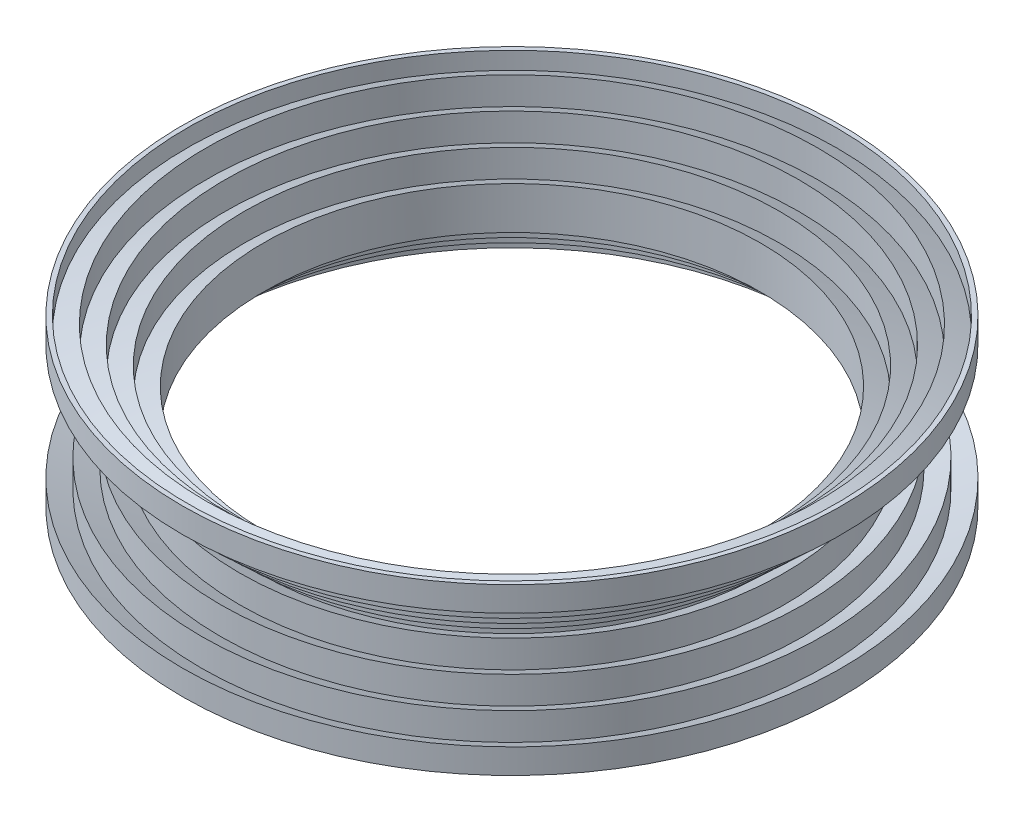
ISO-10303-21;
HEADER;
FILE_DESCRIPTION(('STEP AP214'),'2;1');
FILE_NAME('part.step','',(''),(''),'','','');
FILE_SCHEMA(('AUTOMOTIVE_DESIGN { 1 0 10303 214 1 1 1 1 }'));
ENDSEC;
DATA;
#1=APPLICATION_CONTEXT('core data for automotive mechanical design processes');
#2=APPLICATION_PROTOCOL_DEFINITION('international standard','automotive_design',2000,#1);
#3=PRODUCT_CONTEXT('',#1,'mechanical');
#4=PRODUCT('Part','Part','',(#3));
#5=PRODUCT_RELATED_PRODUCT_CATEGORY('part','',(#4));
#6=PRODUCT_DEFINITION_FORMATION('','',#4);
#7=PRODUCT_DEFINITION_CONTEXT('part definition',#1,'design');
#8=PRODUCT_DEFINITION('design','',#6,#7);
#9=PRODUCT_DEFINITION_SHAPE('','',#8);
#10=(LENGTH_UNIT() NAMED_UNIT(*) SI_UNIT(.MILLI.,.METRE.));
#11=(NAMED_UNIT(*) PLANE_ANGLE_UNIT() SI_UNIT($,.RADIAN.));
#12=(NAMED_UNIT(*) SI_UNIT($,.STERADIAN.) SOLID_ANGLE_UNIT());
#13=UNCERTAINTY_MEASURE_WITH_UNIT(LENGTH_MEASURE(1.E-05),#10,'distance_accuracy_value','');
#14=(GEOMETRIC_REPRESENTATION_CONTEXT(3) GLOBAL_UNCERTAINTY_ASSIGNED_CONTEXT((#13)) GLOBAL_UNIT_ASSIGNED_CONTEXT((#10,
#11,#12)) REPRESENTATION_CONTEXT('',''));
#15=CARTESIAN_POINT('',(0.,0.,0.));
#16=DIRECTION('',(0.,0.,1.));
#17=DIRECTION('',(1.,0.,0.));
#18=AXIS2_PLACEMENT_3D('',#15,#16,#17);
#19=CARTESIAN_POINT('',(0.,1.2,0.));
#20=DIRECTION('',(0.,-1.,0.));
#21=DIRECTION('',(0.,0.,-1.));
#22=AXIS2_PLACEMENT_3D('',#19,#20,#21);
#23=CYLINDRICAL_SURFACE('',#22,35.8938037049019);
#24=CARTESIAN_POINT('',(0.,0.,0.));
#25=DIRECTION('',(0.,1.,0.));
#26=DIRECTION('',(0.,0.,1.));
#27=AXIS2_PLACEMENT_3D('',#24,#25,#26);
#28=CIRCLE('',#27,35.8938037049019);
#29=CARTESIAN_POINT('',(0.,0.,35.8938037049019));
#30=VERTEX_POINT('',#29);
#31=EDGE_CURVE('E10',#30,#30,#28,.T.);
#32=ORIENTED_EDGE('',*,*,#31,.T.);
#33=EDGE_LOOP('',(#32));
#34=FACE_BOUND('',#33,.T.);
#35=CARTESIAN_POINT('',(0.,2.7,0.));
#36=DIRECTION('',(0.,1.,0.));
#37=DIRECTION('',(0.,0.,1.));
#38=AXIS2_PLACEMENT_3D('',#35,#36,#37);
#39=CIRCLE('',#38,35.8938037049019);
#40=CARTESIAN_POINT('',(0.,2.7,35.8938037049019));
#41=VERTEX_POINT('',#40);
#42=EDGE_CURVE('E77',#41,#41,#39,.T.);
#43=ORIENTED_EDGE('',*,*,#42,.F.);
#44=EDGE_LOOP('',(#43));
#45=FACE_BOUND('',#44,.T.);
#46=ADVANCED_FACE('F38',(#34,#45),#23,.T.);
#47=CARTESIAN_POINT('',(0.,0.,0.));
#48=DIRECTION('',(0.,1.,0.));
#49=DIRECTION('',(0.,0.,1.));
#50=AXIS2_PLACEMENT_3D('',#47,#48,#49);
#51=PLANE('',#50);
#52=CARTESIAN_POINT('',(0.,0.,0.));
#53=DIRECTION('',(0.,1.,0.));
#54=DIRECTION('',(0.,0.,1.));
#55=AXIS2_PLACEMENT_3D('',#52,#53,#54);
#56=CIRCLE('',#55,35.3938037049019);
#57=CARTESIAN_POINT('',(0.,0.,35.3938037049019));
#58=VERTEX_POINT('',#57);
#59=EDGE_CURVE('E120',#58,#58,#56,.T.);
#60=ORIENTED_EDGE('',*,*,#59,.T.);
#61=EDGE_LOOP('',(#60));
#62=FACE_BOUND('',#61,.T.);
#63=ORIENTED_EDGE('',*,*,#31,.F.);
#64=EDGE_LOOP('',(#63));
#65=FACE_BOUND('',#64,.T.);
#66=ADVANCED_FACE('F208',(#62,#65),#51,.F.);
#67=CARTESIAN_POINT('',(0.,8.55328911237355,0.));
#68=DIRECTION('',(0.,1.,0.));
#69=DIRECTION('',(0.,0.,1.));
#70=AXIS2_PLACEMENT_3D('',#67,#68,#69);
#71=CONICAL_SURFACE('',#70,29.6615082556337,1.10323322026267);
#72=CARTESIAN_POINT('',(0.,7.50438548316474,0.));
#73=DIRECTION('',(0.,1.,0.));
#74=DIRECTION('',(0.,0.,1.));
#75=AXIS2_PLACEMENT_3D('',#72,#73,#74);
#76=CIRCLE('',#75,27.584076439211);
#77=CARTESIAN_POINT('',(0.,7.50438548316474,27.584076439211));
#78=VERTEX_POINT('',#77);
#79=EDGE_CURVE('E81',#78,#78,#76,.T.);
#80=ORIENTED_EDGE('',*,*,#79,.F.);
#81=EDGE_LOOP('',(#80));
#82=FACE_BOUND('',#81,.T.);
#83=CARTESIAN_POINT('',(0.,8.55328911237355,0.));
#84=DIRECTION('',(0.,1.,0.));
#85=DIRECTION('',(0.,0.,1.));
#86=AXIS2_PLACEMENT_3D('',#83,#84,#85);
#87=CIRCLE('',#86,29.6615082556337);
#88=CARTESIAN_POINT('',(0.,8.55328911237355,29.6615082556337));
#89=VERTEX_POINT('',#88);
#90=EDGE_CURVE('E45',#89,#89,#87,.T.);
#91=ORIENTED_EDGE('',*,*,#90,.T.);
#92=EDGE_LOOP('',(#91));
#93=FACE_BOUND('',#92,.T.);
#94=ADVANCED_FACE('F211',(#82,#93),#71,.F.);
#95=CARTESIAN_POINT('',(0.,9.,0.));
#96=DIRECTION('',(0.,1.,0.));
#97=DIRECTION('',(0.,0.,1.));
#98=AXIS2_PLACEMENT_3D('',#95,#96,#97);
#99=CYLINDRICAL_SURFACE('',#98,29.6615082556337);
#100=ORIENTED_EDGE('',*,*,#90,.F.);
#101=EDGE_LOOP('',(#100));
#102=FACE_BOUND('',#101,.T.);
#103=CARTESIAN_POINT('',(0.,5.55328911237355,0.));
#104=DIRECTION('',(0.,1.,0.));
#105=DIRECTION('',(0.,0.,1.));
#106=AXIS2_PLACEMENT_3D('',#103,#104,#105);
#107=CIRCLE('',#106,29.6615082556337);
#108=CARTESIAN_POINT('',(0.,5.55328911237355,29.6615082556337));
#109=VERTEX_POINT('',#108);
#110=EDGE_CURVE('E52',#109,#109,#107,.T.);
#111=ORIENTED_EDGE('',*,*,#110,.T.);
#112=EDGE_LOOP('',(#111));
#113=FACE_BOUND('',#112,.T.);
#114=ADVANCED_FACE('F244',(#102,#113),#99,.T.);
#115=CARTESIAN_POINT('',(0.,6.60219274158237,0.));
#116=DIRECTION('',(0.,1.,0.));
#117=DIRECTION('',(0.,0.,1.));
#118=AXIS2_PLACEMENT_3D('',#115,#116,#117);
#119=CONICAL_SURFACE('',#118,31.7389400720564,1.10323322026267);
#120=ORIENTED_EDGE('',*,*,#110,.F.);
#121=EDGE_LOOP('',(#120));
#122=FACE_BOUND('',#121,.T.);
#123=CARTESIAN_POINT('',(0.,6.60219274158237,0.));
#124=DIRECTION('',(0.,1.,0.));
#125=DIRECTION('',(0.,0.,1.));
#126=AXIS2_PLACEMENT_3D('',#123,#124,#125);
#127=CIRCLE('',#126,31.7389400720564);
#128=CARTESIAN_POINT('',(0.,6.60219274158237,31.7389400720564));
#129=VERTEX_POINT('',#128);
#130=EDGE_CURVE('E59',#129,#129,#127,.T.);
#131=ORIENTED_EDGE('',*,*,#130,.T.);
#132=EDGE_LOOP('',(#131));
#133=FACE_BOUND('',#132,.T.);
#134=ADVANCED_FACE('F240',(#122,#133),#119,.F.);
#135=CARTESIAN_POINT('',(0.,9.,0.));
#136=DIRECTION('',(0.,1.,0.));
#137=DIRECTION('',(0.,0.,1.));
#138=AXIS2_PLACEMENT_3D('',#135,#136,#137);
#139=CYLINDRICAL_SURFACE('',#138,31.7389400720564);
#140=ORIENTED_EDGE('',*,*,#130,.F.);
#141=EDGE_LOOP('',(#140));
#142=FACE_BOUND('',#141,.T.);
#143=CARTESIAN_POINT('',(0.,3.60219274158237,0.));
#144=DIRECTION('',(0.,1.,0.));
#145=DIRECTION('',(0.,0.,1.));
#146=AXIS2_PLACEMENT_3D('',#143,#144,#145);
#147=CIRCLE('',#146,31.7389400720564);
#148=CARTESIAN_POINT('',(0.,3.60219274158237,31.7389400720564));
#149=VERTEX_POINT('',#148);
#150=EDGE_CURVE('E65',#149,#149,#147,.T.);
#151=ORIENTED_EDGE('',*,*,#150,.T.);
#152=EDGE_LOOP('',(#151));
#153=FACE_BOUND('',#152,.T.);
#154=ADVANCED_FACE('F236',(#142,#153),#139,.T.);
#155=CARTESIAN_POINT('',(0.,4.65109637079118,0.));
#156=DIRECTION('',(0.,1.,0.));
#157=DIRECTION('',(0.,0.,1.));
#158=AXIS2_PLACEMENT_3D('',#155,#156,#157);
#159=CONICAL_SURFACE('',#158,33.8163718884792,1.10323322026267);
#160=ORIENTED_EDGE('',*,*,#150,.F.);
#161=EDGE_LOOP('',(#160));
#162=FACE_BOUND('',#161,.T.);
#163=CARTESIAN_POINT('',(0.,4.65109637079118,0.));
#164=DIRECTION('',(0.,1.,0.));
#165=DIRECTION('',(0.,0.,1.));
#166=AXIS2_PLACEMENT_3D('',#163,#164,#165);
#167=CIRCLE('',#166,33.8163718884792);
#168=CARTESIAN_POINT('',(0.,4.65109637079118,33.8163718884792));
#169=VERTEX_POINT('',#168);
#170=EDGE_CURVE('E69',#169,#169,#167,.T.);
#171=ORIENTED_EDGE('',*,*,#170,.T.);
#172=EDGE_LOOP('',(#171));
#173=FACE_BOUND('',#172,.T.);
#174=ADVANCED_FACE('F228',(#162,#173),#159,.F.);
#175=CARTESIAN_POINT('',(0.,9.,0.));
#176=DIRECTION('',(0.,1.,0.));
#177=DIRECTION('',(0.,0.,1.));
#178=AXIS2_PLACEMENT_3D('',#175,#176,#177);
#179=CYLINDRICAL_SURFACE('',#178,33.8163718884792);
#180=ORIENTED_EDGE('',*,*,#170,.F.);
#181=EDGE_LOOP('',(#180));
#182=FACE_BOUND('',#181,.T.);
#183=CARTESIAN_POINT('',(0.,1.65109637079118,0.));
#184=DIRECTION('',(0.,1.,0.));
#185=DIRECTION('',(0.,0.,1.));
#186=AXIS2_PLACEMENT_3D('',#183,#184,#185);
#187=CIRCLE('',#186,33.8163718884792);
#188=CARTESIAN_POINT('',(0.,1.65109637079118,33.8163718884792));
#189=VERTEX_POINT('',#188);
#190=EDGE_CURVE('E73',#189,#189,#187,.T.);
#191=ORIENTED_EDGE('',*,*,#190,.T.);
#192=EDGE_LOOP('',(#191));
#193=FACE_BOUND('',#192,.T.);
#194=ADVANCED_FACE('F219',(#182,#193),#179,.T.);
#195=CARTESIAN_POINT('',(0.,2.7,0.));
#196=DIRECTION('',(0.,1.,0.));
#197=DIRECTION('',(0.,0.,1.));
#198=AXIS2_PLACEMENT_3D('',#195,#196,#197);
#199=CONICAL_SURFACE('',#198,35.8938037049019,1.10323322026267);
#200=ORIENTED_EDGE('',*,*,#190,.F.);
#201=EDGE_LOOP('',(#200));
#202=FACE_BOUND('',#201,.T.);
#203=ORIENTED_EDGE('',*,*,#42,.T.);
#204=EDGE_LOOP('',(#203));
#205=FACE_BOUND('',#204,.T.);
#206=ADVANCED_FACE('F216',(#202,#205),#199,.F.);
#207=CARTESIAN_POINT('',(0.,9.,0.));
#208=DIRECTION('',(0.,1.,0.));
#209=DIRECTION('',(0.,0.,1.));
#210=AXIS2_PLACEMENT_3D('',#207,#208,#209);
#211=CYLINDRICAL_SURFACE('',#210,27.584076439211);
#212=ORIENTED_EDGE('',*,*,#79,.T.);
#213=EDGE_LOOP('',(#212));
#214=FACE_BOUND('',#213,.T.);
#215=CARTESIAN_POINT('',(0.,10.4956145168353,0.));
#216=DIRECTION('',(0.,1.,0.));
#217=DIRECTION('',(0.,0.,1.));
#218=AXIS2_PLACEMENT_3D('',#215,#216,#217);
#219=CIRCLE('',#218,27.584076439211);
#220=CARTESIAN_POINT('',(0.,10.4956145168353,27.584076439211));
#221=VERTEX_POINT('',#220);
#222=EDGE_CURVE('E116',#221,#221,#219,.T.);
#223=ORIENTED_EDGE('',*,*,#222,.F.);
#224=EDGE_LOOP('',(#223));
#225=FACE_BOUND('',#224,.T.);
#226=ADVANCED_FACE('F218',(#214,#225),#211,.T.);
#227=CARTESIAN_POINT('',(0.,16.8,0.));
#228=DIRECTION('',(0.,1.,0.));
#229=DIRECTION('',(0.,0.,-1.));
#230=AXIS2_PLACEMENT_3D('',#227,#228,#229);
#231=CYLINDRICAL_SURFACE('',#230,35.8938037049019);
#232=CARTESIAN_POINT('',(0.,18.,0.));
#233=DIRECTION('',(0.,1.,0.));
#234=DIRECTION('',(0.,0.,1.));
#235=AXIS2_PLACEMENT_3D('',#232,#233,#234);
#236=CIRCLE('',#235,35.8938037049019);
#237=CARTESIAN_POINT('',(0.,18.,35.8938037049019));
#238=VERTEX_POINT('',#237);
#239=EDGE_CURVE('E85',#238,#238,#236,.T.);
#240=ORIENTED_EDGE('',*,*,#239,.F.);
#241=EDGE_LOOP('',(#240));
#242=FACE_BOUND('',#241,.T.);
#243=CARTESIAN_POINT('',(0.,15.3,0.));
#244=DIRECTION('',(0.,1.,0.));
#245=DIRECTION('',(0.,0.,1.));
#246=AXIS2_PLACEMENT_3D('',#243,#244,#245);
#247=CIRCLE('',#246,35.8938037049019);
#248=CARTESIAN_POINT('',(0.,15.3,35.8938037049019));
#249=VERTEX_POINT('',#248);
#250=EDGE_CURVE('E112',#249,#249,#247,.T.);
#251=ORIENTED_EDGE('',*,*,#250,.T.);
#252=EDGE_LOOP('',(#251));
#253=FACE_BOUND('',#252,.T.);
#254=ADVANCED_FACE('F225',(#242,#253),#231,.T.);
#255=CARTESIAN_POINT('',(0.,18.,0.));
#256=DIRECTION('',(0.,-1.,0.));
#257=DIRECTION('',(0.,0.,1.));
#258=AXIS2_PLACEMENT_3D('',#255,#256,#257);
#259=PLANE('',#258);
#260=CARTESIAN_POINT('',(0.,18.,0.));
#261=DIRECTION('',(0.,-1.,0.));
#262=DIRECTION('',(0.,0.,-1.));
#263=AXIS2_PLACEMENT_3D('',#260,#261,#262);
#264=CIRCLE('',#263,35.3938037049019);
#265=CARTESIAN_POINT('',(0.,18.,-35.3938037049019));
#266=VERTEX_POINT('',#265);
#267=EDGE_CURVE('E121',#266,#266,#264,.F.);
#268=ORIENTED_EDGE('',*,*,#267,.F.);
#269=EDGE_LOOP('',(#268));
#270=FACE_BOUND('',#269,.T.);
#271=ORIENTED_EDGE('',*,*,#239,.T.);
#272=EDGE_LOOP('',(#271));
#273=FACE_BOUND('',#272,.T.);
#274=ADVANCED_FACE('F260',(#270,#273),#259,.F.);
#275=CARTESIAN_POINT('',(0.,9.44671088762644,0.));
#276=DIRECTION('',(0.,-1.,0.));
#277=DIRECTION('',(0.,0.,1.));
#278=AXIS2_PLACEMENT_3D('',#275,#276,#277);
#279=CONICAL_SURFACE('',#278,29.6615082556337,1.10323322026267);
#280=ORIENTED_EDGE('',*,*,#222,.T.);
#281=EDGE_LOOP('',(#280));
#282=FACE_BOUND('',#281,.T.);
#283=CARTESIAN_POINT('',(0.,9.44671088762644,0.));
#284=DIRECTION('',(0.,1.,0.));
#285=DIRECTION('',(0.,0.,1.));
#286=AXIS2_PLACEMENT_3D('',#283,#284,#285);
#287=CIRCLE('',#286,29.6615082556337);
#288=CARTESIAN_POINT('',(0.,9.44671088762644,29.6615082556337));
#289=VERTEX_POINT('',#288);
#290=EDGE_CURVE('E89',#289,#289,#287,.T.);
#291=ORIENTED_EDGE('',*,*,#290,.F.);
#292=EDGE_LOOP('',(#291));
#293=FACE_BOUND('',#292,.T.);
#294=ADVANCED_FACE('F256',(#282,#293),#279,.F.);
#295=CARTESIAN_POINT('',(0.,9.,0.));
#296=DIRECTION('',(0.,-1.,0.));
#297=DIRECTION('',(0.,0.,1.));
#298=AXIS2_PLACEMENT_3D('',#295,#296,#297);
#299=CYLINDRICAL_SURFACE('',#298,29.6615082556337);
#300=ORIENTED_EDGE('',*,*,#290,.T.);
#301=EDGE_LOOP('',(#300));
#302=FACE_BOUND('',#301,.T.);
#303=CARTESIAN_POINT('',(0.,12.4467108876264,0.));
#304=DIRECTION('',(0.,1.,0.));
#305=DIRECTION('',(0.,0.,1.));
#306=AXIS2_PLACEMENT_3D('',#303,#304,#305);
#307=CIRCLE('',#306,29.6615082556337);
#308=CARTESIAN_POINT('',(0.,12.4467108876264,29.6615082556337));
#309=VERTEX_POINT('',#308);
#310=EDGE_CURVE('E93',#309,#309,#307,.T.);
#311=ORIENTED_EDGE('',*,*,#310,.F.);
#312=EDGE_LOOP('',(#311));
#313=FACE_BOUND('',#312,.T.);
#314=ADVANCED_FACE('F259',(#302,#313),#299,.T.);
#315=CARTESIAN_POINT('',(0.,11.3978072584176,0.));
#316=DIRECTION('',(0.,-1.,0.));
#317=DIRECTION('',(0.,0.,1.));
#318=AXIS2_PLACEMENT_3D('',#315,#316,#317);
#319=CONICAL_SURFACE('',#318,31.7389400720564,1.10323322026267);
#320=ORIENTED_EDGE('',*,*,#310,.T.);
#321=EDGE_LOOP('',(#320));
#322=FACE_BOUND('',#321,.T.);
#323=CARTESIAN_POINT('',(0.,11.3978072584176,0.));
#324=DIRECTION('',(0.,1.,0.));
#325=DIRECTION('',(0.,0.,1.));
#326=AXIS2_PLACEMENT_3D('',#323,#324,#325);
#327=CIRCLE('',#326,31.7389400720564);
#328=CARTESIAN_POINT('',(0.,11.3978072584176,31.7389400720564));
#329=VERTEX_POINT('',#328);
#330=EDGE_CURVE('E97',#329,#329,#327,.T.);
#331=ORIENTED_EDGE('',*,*,#330,.F.);
#332=EDGE_LOOP('',(#331));
#333=FACE_BOUND('',#332,.T.);
#334=ADVANCED_FACE('F266',(#322,#333),#319,.F.);
#335=CARTESIAN_POINT('',(0.,9.,0.));
#336=DIRECTION('',(0.,-1.,0.));
#337=DIRECTION('',(0.,0.,1.));
#338=AXIS2_PLACEMENT_3D('',#335,#336,#337);
#339=CYLINDRICAL_SURFACE('',#338,31.7389400720564);
#340=ORIENTED_EDGE('',*,*,#330,.T.);
#341=EDGE_LOOP('',(#340));
#342=FACE_BOUND('',#341,.T.);
#343=CARTESIAN_POINT('',(0.,14.3978072584176,0.));
#344=DIRECTION('',(0.,1.,0.));
#345=DIRECTION('',(0.,0.,1.));
#346=AXIS2_PLACEMENT_3D('',#343,#344,#345);
#347=CIRCLE('',#346,31.7389400720564);
#348=CARTESIAN_POINT('',(0.,14.3978072584176,31.7389400720564));
#349=VERTEX_POINT('',#348);
#350=EDGE_CURVE('E100',#349,#349,#347,.T.);
#351=ORIENTED_EDGE('',*,*,#350,.F.);
#352=EDGE_LOOP('',(#351));
#353=FACE_BOUND('',#352,.T.);
#354=ADVANCED_FACE('F272',(#342,#353),#339,.T.);
#355=CARTESIAN_POINT('',(0.,13.3489036292088,0.));
#356=DIRECTION('',(0.,-1.,0.));
#357=DIRECTION('',(0.,0.,1.));
#358=AXIS2_PLACEMENT_3D('',#355,#356,#357);
#359=CONICAL_SURFACE('',#358,33.8163718884792,1.10323322026267);
#360=ORIENTED_EDGE('',*,*,#350,.T.);
#361=EDGE_LOOP('',(#360));
#362=FACE_BOUND('',#361,.T.);
#363=CARTESIAN_POINT('',(0.,13.3489036292088,0.));
#364=DIRECTION('',(0.,1.,0.));
#365=DIRECTION('',(0.,0.,1.));
#366=AXIS2_PLACEMENT_3D('',#363,#364,#365);
#367=CIRCLE('',#366,33.8163718884792);
#368=CARTESIAN_POINT('',(0.,13.3489036292088,33.8163718884792));
#369=VERTEX_POINT('',#368);
#370=EDGE_CURVE('E104',#369,#369,#367,.T.);
#371=ORIENTED_EDGE('',*,*,#370,.F.);
#372=EDGE_LOOP('',(#371));
#373=FACE_BOUND('',#372,.T.);
#374=ADVANCED_FACE('F278',(#362,#373),#359,.F.);
#375=CARTESIAN_POINT('',(0.,9.,0.));
#376=DIRECTION('',(0.,-1.,0.));
#377=DIRECTION('',(0.,0.,1.));
#378=AXIS2_PLACEMENT_3D('',#375,#376,#377);
#379=CYLINDRICAL_SURFACE('',#378,33.8163718884792);
#380=ORIENTED_EDGE('',*,*,#370,.T.);
#381=EDGE_LOOP('',(#380));
#382=FACE_BOUND('',#381,.T.);
#383=CARTESIAN_POINT('',(0.,16.3489036292088,0.));
#384=DIRECTION('',(0.,1.,0.));
#385=DIRECTION('',(0.,0.,1.));
#386=AXIS2_PLACEMENT_3D('',#383,#384,#385);
#387=CIRCLE('',#386,33.8163718884792);
#388=CARTESIAN_POINT('',(0.,16.3489036292088,33.8163718884792));
#389=VERTEX_POINT('',#388);
#390=EDGE_CURVE('E108',#389,#389,#387,.T.);
#391=ORIENTED_EDGE('',*,*,#390,.F.);
#392=EDGE_LOOP('',(#391));
#393=FACE_BOUND('',#392,.T.);
#394=ADVANCED_FACE('F284',(#382,#393),#379,.T.);
#395=CARTESIAN_POINT('',(0.,15.3,0.));
#396=DIRECTION('',(0.,-1.,0.));
#397=DIRECTION('',(0.,0.,1.));
#398=AXIS2_PLACEMENT_3D('',#395,#396,#397);
#399=CONICAL_SURFACE('',#398,35.8938037049019,1.10323322026267);
#400=ORIENTED_EDGE('',*,*,#390,.T.);
#401=EDGE_LOOP('',(#400));
#402=FACE_BOUND('',#401,.T.);
#403=ORIENTED_EDGE('',*,*,#250,.F.);
#404=EDGE_LOOP('',(#403));
#405=FACE_BOUND('',#404,.T.);
#406=ADVANCED_FACE('F290',(#402,#405),#399,.F.);
#407=CARTESIAN_POINT('',(0.,1.2,0.));
#408=DIRECTION('',(0.,-1.,0.));
#409=DIRECTION('',(0.,0.,-1.));
#410=AXIS2_PLACEMENT_3D('',#407,#408,#409);
#411=CYLINDRICAL_SURFACE('',#410,35.3938037049019);
#412=ORIENTED_EDGE('',*,*,#59,.F.);
#413=EDGE_LOOP('',(#412));
#414=FACE_BOUND('',#413,.T.);
#415=CARTESIAN_POINT('',(0.,1.8874301458899,0.));
#416=DIRECTION('',(0.,1.,0.));
#417=DIRECTION('',(0.,0.,1.));
#418=AXIS2_PLACEMENT_3D('',#415,#416,#417);
#419=CIRCLE('',#418,35.3938037049019);
#420=CARTESIAN_POINT('',(0.,1.8874301458899,35.3938037049019));
#421=VERTEX_POINT('',#420);
#422=EDGE_CURVE('E164',#421,#421,#419,.T.);
#423=ORIENTED_EDGE('',*,*,#422,.T.);
#424=EDGE_LOOP('',(#423));
#425=FACE_BOUND('',#424,.T.);
#426=ADVANCED_FACE('F190',(#414,#425),#411,.F.);
#427=CARTESIAN_POINT('',(0.,8.10695447463952,0.));
#428=DIRECTION('',(0.,1.,0.));
#429=DIRECTION('',(0.,0.,1.));
#430=AXIS2_PLACEMENT_3D('',#427,#428,#429);
#431=CONICAL_SURFACE('',#430,29.8868643985693,1.10323322026267);
#432=CARTESIAN_POINT('',(0.,6.69181562905464,0.));
#433=DIRECTION('',(0.,1.,0.));
#434=DIRECTION('',(0.,0.,1.));
#435=AXIS2_PLACEMENT_3D('',#432,#433,#434);
#436=CIRCLE('',#435,27.084076439211);
#437=CARTESIAN_POINT('',(0.,6.69181562905464,27.084076439211));
#438=VERTEX_POINT('',#437);
#439=EDGE_CURVE('E125',#438,#438,#436,.T.);
#440=ORIENTED_EDGE('',*,*,#439,.T.);
#441=EDGE_LOOP('',(#440));
#442=FACE_BOUND('',#441,.T.);
#443=CARTESIAN_POINT('',(0.,7.74071925826345,0.));
#444=DIRECTION('',(0.,1.,0.));
#445=DIRECTION('',(0.,0.,1.));
#446=AXIS2_PLACEMENT_3D('',#443,#444,#445);
#447=CIRCLE('',#446,29.1615082556337);
#448=CARTESIAN_POINT('',(0.,7.74071925826345,29.1615082556337));
#449=VERTEX_POINT('',#448);
#450=EDGE_CURVE('E130',#449,#449,#447,.T.);
#451=ORIENTED_EDGE('',*,*,#450,.F.);
#452=EDGE_LOOP('',(#451));
#453=FACE_BOUND('',#452,.T.);
#454=ADVANCED_FACE('F463',(#442,#453),#431,.T.);
#455=CARTESIAN_POINT('',(0.,9.,0.));
#456=DIRECTION('',(0.,1.,0.));
#457=DIRECTION('',(0.,0.,1.));
#458=AXIS2_PLACEMENT_3D('',#455,#456,#457);
#459=CYLINDRICAL_SURFACE('',#458,29.1615082556337);
#460=ORIENTED_EDGE('',*,*,#450,.T.);
#461=EDGE_LOOP('',(#460));
#462=FACE_BOUND('',#461,.T.);
#463=CARTESIAN_POINT('',(0.,4.74071925826346,0.));
#464=DIRECTION('',(0.,1.,0.));
#465=DIRECTION('',(0.,0.,1.));
#466=AXIS2_PLACEMENT_3D('',#463,#464,#465);
#467=CIRCLE('',#466,29.1615082556337);
#468=CARTESIAN_POINT('',(0.,4.74071925826346,29.1615082556337));
#469=VERTEX_POINT('',#468);
#470=EDGE_CURVE('E167',#469,#469,#467,.T.);
#471=ORIENTED_EDGE('',*,*,#470,.F.);
#472=EDGE_LOOP('',(#471));
#473=FACE_BOUND('',#472,.T.);
#474=ADVANCED_FACE('F452',(#462,#473),#459,.F.);
#475=CARTESIAN_POINT('',(0.,6.15585810384834,0.));
#476=DIRECTION('',(0.,1.,0.));
#477=DIRECTION('',(0.,0.,1.));
#478=AXIS2_PLACEMENT_3D('',#475,#476,#477);
#479=CONICAL_SURFACE('',#478,31.9642962149921,1.10323322026267);
#480=ORIENTED_EDGE('',*,*,#470,.T.);
#481=EDGE_LOOP('',(#480));
#482=FACE_BOUND('',#481,.T.);
#483=CARTESIAN_POINT('',(0.,5.78962288747227,0.));
#484=DIRECTION('',(0.,1.,0.));
#485=DIRECTION('',(0.,0.,1.));
#486=AXIS2_PLACEMENT_3D('',#483,#484,#485);
#487=CIRCLE('',#486,31.2389400720564);
#488=CARTESIAN_POINT('',(0.,5.78962288747227,31.2389400720564));
#489=VERTEX_POINT('',#488);
#490=EDGE_CURVE('E171',#489,#489,#487,.T.);
#491=ORIENTED_EDGE('',*,*,#490,.F.);
#492=EDGE_LOOP('',(#491));
#493=FACE_BOUND('',#492,.T.);
#494=ADVANCED_FACE('F440',(#482,#493),#479,.T.);
#495=CARTESIAN_POINT('',(0.,9.,0.));
#496=DIRECTION('',(0.,1.,0.));
#497=DIRECTION('',(0.,0.,1.));
#498=AXIS2_PLACEMENT_3D('',#495,#496,#497);
#499=CYLINDRICAL_SURFACE('',#498,31.2389400720564);
#500=ORIENTED_EDGE('',*,*,#490,.T.);
#501=EDGE_LOOP('',(#500));
#502=FACE_BOUND('',#501,.T.);
#503=CARTESIAN_POINT('',(0.,2.78962288747227,0.));
#504=DIRECTION('',(0.,1.,0.));
#505=DIRECTION('',(0.,0.,1.));
#506=AXIS2_PLACEMENT_3D('',#503,#504,#505);
#507=CIRCLE('',#506,31.2389400720564);
#508=CARTESIAN_POINT('',(0.,2.78962288747227,31.2389400720564));
#509=VERTEX_POINT('',#508);
#510=EDGE_CURVE('E175',#509,#509,#507,.T.);
#511=ORIENTED_EDGE('',*,*,#510,.F.);
#512=EDGE_LOOP('',(#511));
#513=FACE_BOUND('',#512,.T.);
#514=ADVANCED_FACE('F429',(#502,#513),#499,.F.);
#515=CARTESIAN_POINT('',(0.,4.20476173305715,0.));
#516=DIRECTION('',(0.,1.,0.));
#517=DIRECTION('',(0.,0.,1.));
#518=AXIS2_PLACEMENT_3D('',#515,#516,#517);
#519=CONICAL_SURFACE('',#518,34.0417280314148,1.10323322026267);
#520=ORIENTED_EDGE('',*,*,#510,.T.);
#521=EDGE_LOOP('',(#520));
#522=FACE_BOUND('',#521,.T.);
#523=CARTESIAN_POINT('',(0.,3.83852651668109,0.));
#524=DIRECTION('',(0.,1.,0.));
#525=DIRECTION('',(0.,0.,1.));
#526=AXIS2_PLACEMENT_3D('',#523,#524,#525);
#527=CIRCLE('',#526,33.3163718884792);
#528=CARTESIAN_POINT('',(0.,3.83852651668109,33.3163718884792));
#529=VERTEX_POINT('',#528);
#530=EDGE_CURVE('E179',#529,#529,#527,.T.);
#531=ORIENTED_EDGE('',*,*,#530,.F.);
#532=EDGE_LOOP('',(#531));
#533=FACE_BOUND('',#532,.T.);
#534=ADVANCED_FACE('F204',(#522,#533),#519,.T.);
#535=CARTESIAN_POINT('',(0.,9.,0.));
#536=DIRECTION('',(0.,1.,0.));
#537=DIRECTION('',(0.,0.,1.));
#538=AXIS2_PLACEMENT_3D('',#535,#536,#537);
#539=CYLINDRICAL_SURFACE('',#538,33.3163718884792);
#540=ORIENTED_EDGE('',*,*,#530,.T.);
#541=EDGE_LOOP('',(#540));
#542=FACE_BOUND('',#541,.T.);
#543=CARTESIAN_POINT('',(0.,0.838526516681087,0.));
#544=DIRECTION('',(0.,1.,0.));
#545=DIRECTION('',(0.,0.,1.));
#546=AXIS2_PLACEMENT_3D('',#543,#544,#545);
#547=CIRCLE('',#546,33.3163718884792);
#548=CARTESIAN_POINT('',(0.,0.838526516681087,33.3163718884792));
#549=VERTEX_POINT('',#548);
#550=EDGE_CURVE('E183',#549,#549,#547,.T.);
#551=ORIENTED_EDGE('',*,*,#550,.F.);
#552=EDGE_LOOP('',(#551));
#553=FACE_BOUND('',#552,.T.);
#554=ADVANCED_FACE('F195',(#542,#553),#539,.F.);
#555=CARTESIAN_POINT('',(0.,2.25366536226597,0.));
#556=DIRECTION('',(0.,1.,0.));
#557=DIRECTION('',(0.,0.,1.));
#558=AXIS2_PLACEMENT_3D('',#555,#556,#557);
#559=CONICAL_SURFACE('',#558,36.1191598478376,1.10323322026267);
#560=ORIENTED_EDGE('',*,*,#550,.T.);
#561=EDGE_LOOP('',(#560));
#562=FACE_BOUND('',#561,.T.);
#563=ORIENTED_EDGE('',*,*,#422,.F.);
#564=EDGE_LOOP('',(#563));
#565=FACE_BOUND('',#564,.T.);
#566=ADVANCED_FACE('F192',(#562,#565),#559,.T.);
#567=CARTESIAN_POINT('',(0.,9.,0.));
#568=DIRECTION('',(0.,1.,0.));
#569=DIRECTION('',(0.,0.,1.));
#570=AXIS2_PLACEMENT_3D('',#567,#568,#569);
#571=CYLINDRICAL_SURFACE('',#570,27.084076439211);
#572=ORIENTED_EDGE('',*,*,#439,.F.);
#573=EDGE_LOOP('',(#572));
#574=FACE_BOUND('',#573,.T.);
#575=CARTESIAN_POINT('',(0.,11.3081843709454,0.));
#576=DIRECTION('',(0.,-1.,0.));
#577=DIRECTION('',(0.,0.,-1.));
#578=AXIS2_PLACEMENT_3D('',#575,#576,#577);
#579=CIRCLE('',#578,27.084076439211);
#580=CARTESIAN_POINT('',(0.,11.3081843709454,-27.084076439211));
#581=VERTEX_POINT('',#580);
#582=EDGE_CURVE('E136',#581,#581,#579,.F.);
#583=ORIENTED_EDGE('',*,*,#582,.T.);
#584=EDGE_LOOP('',(#583));
#585=FACE_BOUND('',#584,.T.);
#586=ADVANCED_FACE('F194',(#574,#585),#571,.F.);
#587=CARTESIAN_POINT('',(0.,16.8,0.));
#588=DIRECTION('',(0.,1.,0.));
#589=DIRECTION('',(0.,0.,-1.));
#590=AXIS2_PLACEMENT_3D('',#587,#588,#589);
#591=CYLINDRICAL_SURFACE('',#590,35.3938037049019);
#592=ORIENTED_EDGE('',*,*,#267,.T.);
#593=EDGE_LOOP('',(#592));
#594=FACE_BOUND('',#593,.T.);
#595=CARTESIAN_POINT('',(0.,16.1125698541101,0.));
#596=DIRECTION('',(0.,-1.,0.));
#597=DIRECTION('',(0.,0.,-1.));
#598=AXIS2_PLACEMENT_3D('',#595,#596,#597);
#599=CIRCLE('',#598,35.3938037049019);
#600=CARTESIAN_POINT('',(0.,16.1125698541101,-35.3938037049019));
#601=VERTEX_POINT('',#600);
#602=EDGE_CURVE('E131',#601,#601,#599,.F.);
#603=ORIENTED_EDGE('',*,*,#602,.F.);
#604=EDGE_LOOP('',(#603));
#605=FACE_BOUND('',#604,.T.);
#606=ADVANCED_FACE('F201',(#594,#605),#591,.F.);
#607=CARTESIAN_POINT('',(0.,9.89304552536048,0.));
#608=DIRECTION('',(0.,-1.,0.));
#609=DIRECTION('',(0.,0.,1.));
#610=AXIS2_PLACEMENT_3D('',#607,#608,#609);
#611=CONICAL_SURFACE('',#610,29.8868643985693,1.10323322026267);
#612=ORIENTED_EDGE('',*,*,#582,.F.);
#613=EDGE_LOOP('',(#612));
#614=FACE_BOUND('',#613,.T.);
#615=CARTESIAN_POINT('',(0.,10.2592807417365,0.));
#616=DIRECTION('',(0.,-1.,0.));
#617=DIRECTION('',(0.,0.,-1.));
#618=AXIS2_PLACEMENT_3D('',#615,#616,#617);
#619=CIRCLE('',#618,29.1615082556337);
#620=CARTESIAN_POINT('',(0.,10.2592807417365,-29.1615082556337));
#621=VERTEX_POINT('',#620);
#622=EDGE_CURVE('E126',#621,#621,#619,.F.);
#623=ORIENTED_EDGE('',*,*,#622,.T.);
#624=EDGE_LOOP('',(#623));
#625=FACE_BOUND('',#624,.T.);
#626=ADVANCED_FACE('F330',(#614,#625),#611,.T.);
#627=CARTESIAN_POINT('',(0.,9.,0.));
#628=DIRECTION('',(0.,-1.,0.));
#629=DIRECTION('',(0.,0.,1.));
#630=AXIS2_PLACEMENT_3D('',#627,#628,#629);
#631=CYLINDRICAL_SURFACE('',#630,29.1615082556337);
#632=ORIENTED_EDGE('',*,*,#622,.F.);
#633=EDGE_LOOP('',(#632));
#634=FACE_BOUND('',#633,.T.);
#635=CARTESIAN_POINT('',(0.,13.2592807417365,0.));
#636=DIRECTION('',(0.,-1.,0.));
#637=DIRECTION('',(0.,0.,-1.));
#638=AXIS2_PLACEMENT_3D('',#635,#636,#637);
#639=CIRCLE('',#638,29.1615082556337);
#640=CARTESIAN_POINT('',(0.,13.2592807417365,-29.1615082556337));
#641=VERTEX_POINT('',#640);
#642=EDGE_CURVE('E152',#641,#641,#639,.F.);
#643=ORIENTED_EDGE('',*,*,#642,.T.);
#644=EDGE_LOOP('',(#643));
#645=FACE_BOUND('',#644,.T.);
#646=ADVANCED_FACE('F326',(#634,#645),#631,.F.);
#647=CARTESIAN_POINT('',(0.,11.8441418961517,0.));
#648=DIRECTION('',(0.,-1.,0.));
#649=DIRECTION('',(0.,0.,1.));
#650=AXIS2_PLACEMENT_3D('',#647,#648,#649);
#651=CONICAL_SURFACE('',#650,31.9642962149921,1.10323322026267);
#652=ORIENTED_EDGE('',*,*,#642,.F.);
#653=EDGE_LOOP('',(#652));
#654=FACE_BOUND('',#653,.T.);
#655=CARTESIAN_POINT('',(0.,12.2103771125277,0.));
#656=DIRECTION('',(0.,-1.,0.));
#657=DIRECTION('',(0.,0.,-1.));
#658=AXIS2_PLACEMENT_3D('',#655,#656,#657);
#659=CIRCLE('',#658,31.2389400720564);
#660=CARTESIAN_POINT('',(0.,12.2103771125277,-31.2389400720564));
#661=VERTEX_POINT('',#660);
#662=EDGE_CURVE('E148',#661,#661,#659,.F.);
#663=ORIENTED_EDGE('',*,*,#662,.T.);
#664=EDGE_LOOP('',(#663));
#665=FACE_BOUND('',#664,.T.);
#666=ADVANCED_FACE('F322',(#654,#665),#651,.T.);
#667=CARTESIAN_POINT('',(0.,9.,0.));
#668=DIRECTION('',(0.,-1.,0.));
#669=DIRECTION('',(0.,0.,1.));
#670=AXIS2_PLACEMENT_3D('',#667,#668,#669);
#671=CYLINDRICAL_SURFACE('',#670,31.2389400720564);
#672=ORIENTED_EDGE('',*,*,#662,.F.);
#673=EDGE_LOOP('',(#672));
#674=FACE_BOUND('',#673,.T.);
#675=CARTESIAN_POINT('',(0.,15.2103771125277,0.));
#676=DIRECTION('',(0.,-1.,0.));
#677=DIRECTION('',(0.,0.,-1.));
#678=AXIS2_PLACEMENT_3D('',#675,#676,#677);
#679=CIRCLE('',#678,31.2389400720564);
#680=CARTESIAN_POINT('',(0.,15.2103771125277,-31.2389400720564));
#681=VERTEX_POINT('',#680);
#682=EDGE_CURVE('E144',#681,#681,#679,.F.);
#683=ORIENTED_EDGE('',*,*,#682,.T.);
#684=EDGE_LOOP('',(#683));
#685=FACE_BOUND('',#684,.T.);
#686=ADVANCED_FACE('F318',(#674,#685),#671,.F.);
#687=CARTESIAN_POINT('',(0.,13.7952382669428,0.));
#688=DIRECTION('',(0.,-1.,0.));
#689=DIRECTION('',(0.,0.,1.));
#690=AXIS2_PLACEMENT_3D('',#687,#688,#689);
#691=CONICAL_SURFACE('',#690,34.0417280314148,1.10323322026267);
#692=ORIENTED_EDGE('',*,*,#682,.F.);
#693=EDGE_LOOP('',(#692));
#694=FACE_BOUND('',#693,.T.);
#695=CARTESIAN_POINT('',(0.,14.1614734833189,0.));
#696=DIRECTION('',(0.,-1.,0.));
#697=DIRECTION('',(0.,0.,-1.));
#698=AXIS2_PLACEMENT_3D('',#695,#696,#697);
#699=CIRCLE('',#698,33.3163718884792);
#700=CARTESIAN_POINT('',(0.,14.1614734833189,-33.3163718884792));
#701=VERTEX_POINT('',#700);
#702=EDGE_CURVE('E140',#701,#701,#699,.F.);
#703=ORIENTED_EDGE('',*,*,#702,.T.);
#704=EDGE_LOOP('',(#703));
#705=FACE_BOUND('',#704,.T.);
#706=ADVANCED_FACE('F314',(#694,#705),#691,.T.);
#707=CARTESIAN_POINT('',(0.,9.,0.));
#708=DIRECTION('',(0.,-1.,0.));
#709=DIRECTION('',(0.,0.,1.));
#710=AXIS2_PLACEMENT_3D('',#707,#708,#709);
#711=CYLINDRICAL_SURFACE('',#710,33.3163718884792);
#712=ORIENTED_EDGE('',*,*,#702,.F.);
#713=EDGE_LOOP('',(#712));
#714=FACE_BOUND('',#713,.T.);
#715=CARTESIAN_POINT('',(0.,17.1614734833189,0.));
#716=DIRECTION('',(0.,-1.,0.));
#717=DIRECTION('',(0.,0.,-1.));
#718=AXIS2_PLACEMENT_3D('',#715,#716,#717);
#719=CIRCLE('',#718,33.3163718884792);
#720=CARTESIAN_POINT('',(0.,17.1614734833189,-33.3163718884792));
#721=VERTEX_POINT('',#720);
#722=EDGE_CURVE('E135',#721,#721,#719,.F.);
#723=ORIENTED_EDGE('',*,*,#722,.T.);
#724=EDGE_LOOP('',(#723));
#725=FACE_BOUND('',#724,.T.);
#726=ADVANCED_FACE('F310',(#714,#725),#711,.F.);
#727=CARTESIAN_POINT('',(0.,15.746334637734,0.));
#728=DIRECTION('',(0.,-1.,0.));
#729=DIRECTION('',(0.,0.,1.));
#730=AXIS2_PLACEMENT_3D('',#727,#728,#729);
#731=CONICAL_SURFACE('',#730,36.1191598478376,1.10323322026267);
#732=ORIENTED_EDGE('',*,*,#722,.F.);
#733=EDGE_LOOP('',(#732));
#734=FACE_BOUND('',#733,.T.);
#735=ORIENTED_EDGE('',*,*,#602,.T.);
#736=EDGE_LOOP('',(#735));
#737=FACE_BOUND('',#736,.T.);
#738=ADVANCED_FACE('F307',(#734,#737),#731,.T.);
#739=CLOSED_SHELL('',(#46,#66,#94,#114,#134,#154,#174,#194,#206,#226,#254,#274,#294,#314,#334,
#354,#374,#394,#406,#426,#454,#474,#494,#514,#534,#554,#566,#586,#606,#626,#646,#666,#686,#706,
#726,#738));
#740=MANIFOLD_SOLID_BREP('B2',#739);
#741=ADVANCED_BREP_SHAPE_REPRESENTATION('',(#18,#740),#14);
#742=SHAPE_DEFINITION_REPRESENTATION(#9,#741);
ENDSEC;
END-ISO-10303-21;
